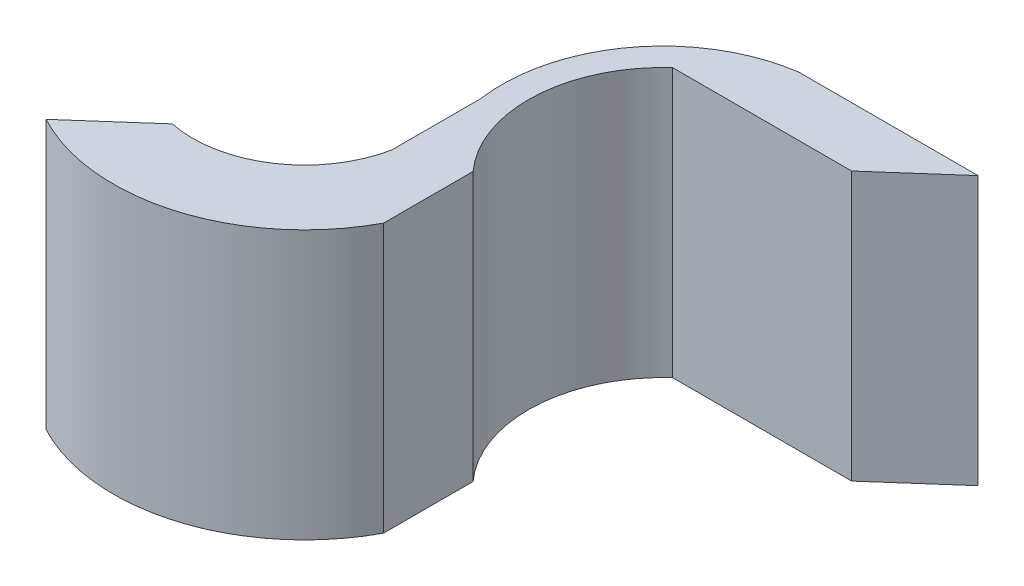
ISO-10303-21;
HEADER;
FILE_DESCRIPTION(('STEP AP214'),'2;1');
FILE_NAME('part.step','',(''),(''),'','','');
FILE_SCHEMA(('AUTOMOTIVE_DESIGN { 1 0 10303 214 1 1 1 1 }'));
ENDSEC;
DATA;
#1=APPLICATION_CONTEXT('core data for automotive mechanical design processes');
#2=APPLICATION_PROTOCOL_DEFINITION('international standard','automotive_design',2000,#1);
#3=PRODUCT_CONTEXT('',#1,'mechanical');
#4=PRODUCT('Part','Part','',(#3));
#5=PRODUCT_RELATED_PRODUCT_CATEGORY('part','',(#4));
#6=PRODUCT_DEFINITION_FORMATION('','',#4);
#7=PRODUCT_DEFINITION_CONTEXT('part definition',#1,'design');
#8=PRODUCT_DEFINITION('design','',#6,#7);
#9=PRODUCT_DEFINITION_SHAPE('','',#8);
#10=(LENGTH_UNIT() NAMED_UNIT(*) SI_UNIT(.MILLI.,.METRE.));
#11=(NAMED_UNIT(*) PLANE_ANGLE_UNIT() SI_UNIT($,.RADIAN.));
#12=(NAMED_UNIT(*) SI_UNIT($,.STERADIAN.) SOLID_ANGLE_UNIT());
#13=UNCERTAINTY_MEASURE_WITH_UNIT(LENGTH_MEASURE(1.E-05),#10,'distance_accuracy_value','');
#14=(GEOMETRIC_REPRESENTATION_CONTEXT(3) GLOBAL_UNCERTAINTY_ASSIGNED_CONTEXT((#13)) GLOBAL_UNIT_ASSIGNED_CONTEXT((#10,
#11,#12)) REPRESENTATION_CONTEXT('',''));
#15=CARTESIAN_POINT('',(0.,0.,0.));
#16=DIRECTION('',(0.,0.,1.));
#17=DIRECTION('',(1.,0.,0.));
#18=AXIS2_PLACEMENT_3D('',#15,#16,#17);
#19=CARTESIAN_POINT('',(0.199607837082,-0.15,0.02239378277661));
#20=DIRECTION('',(0.,0.,-1.));
#21=DIRECTION('',(-1.,0.,0.));
#22=AXIS2_PLACEMENT_3D('',#19,#20,#21);
#23=PLANE('',#22);
#24=DIRECTION('',(1.,0.,0.));
#25=VECTOR('',#24,1.);
#26=CARTESIAN_POINT('',(0.262107837082,-0.15,0.02239378277661));
#27=LINE('',#26,#25);
#28=CARTESIAN_POINT('',(0.199607837081283,-0.15,0.0223937827764583));
#29=VERTEX_POINT('',#28);
#30=CARTESIAN_POINT('',(0.399607837082,-0.15,0.02239378277661));
#31=VERTEX_POINT('',#30);
#32=EDGE_CURVE('E82',#29,#31,#27,.T.);
#33=ORIENTED_EDGE('',*,*,#32,.F.);
#34=DIRECTION('',(0.,1.,0.));
#35=VECTOR('',#34,1.);
#36=CARTESIAN_POINT('',(0.199607837081964,-0.15,0.0223937827763609));
#37=LINE('',#36,#35);
#38=CARTESIAN_POINT('',(0.199607837081283,0.15,0.0223937827764583));
#39=VERTEX_POINT('',#38);
#40=EDGE_CURVE('E174',#39,#29,#37,.F.);
#41=ORIENTED_EDGE('',*,*,#40,.F.);
#42=DIRECTION('',(1.,0.,0.));
#43=VECTOR('',#42,1.);
#44=CARTESIAN_POINT('',(0.262107837082,0.15,0.02239378277661));
#45=LINE('',#44,#43);
#46=CARTESIAN_POINT('',(0.399607837082,0.15,0.02239378277661));
#47=VERTEX_POINT('',#46);
#48=EDGE_CURVE('E104',#47,#39,#45,.F.);
#49=ORIENTED_EDGE('',*,*,#48,.F.);
#50=DIRECTION('',(0.,1.,0.));
#51=VECTOR('',#50,1.);
#52=CARTESIAN_POINT('',(0.399607837082,-0.15,0.02239378277661));
#53=LINE('',#52,#51);
#54=EDGE_CURVE('E92',#47,#31,#53,.F.);
#55=ORIENTED_EDGE('',*,*,#54,.T.);
#56=EDGE_LOOP('',(#33,#41,#49,#55));
#57=FACE_BOUND('',#56,.T.);
#58=ADVANCED_FACE('F16',(#57),#23,.T.);
#59=CARTESIAN_POINT('',(0.399607837082,-0.15,0.02239378277661));
#60=DIRECTION('',(-0.661437827766065,0.,-0.750000000000073));
#61=DIRECTION('',(-0.750000000000073,0.,0.661437827766065));
#62=AXIS2_PLACEMENT_3D('',#59,#60,#61);
#63=PLANE('',#62);
#64=DIRECTION('',(0.749999999999974,0.,-0.661437827766177));
#65=VECTOR('',#64,1.);
#66=CARTESIAN_POINT('',(0.324607837082,0.15,0.08853756555323));
#67=LINE('',#66,#65);
#68=CARTESIAN_POINT('',(0.324607837082,0.15,0.08853756555323));
#69=VERTEX_POINT('',#68);
#70=EDGE_CURVE('E97',#69,#47,#67,.T.);
#71=ORIENTED_EDGE('',*,*,#70,.F.);
#72=DIRECTION('',(0.,1.,0.));
#73=VECTOR('',#72,1.);
#74=CARTESIAN_POINT('',(0.324607837082,0.15,0.08853756555323));
#75=LINE('',#74,#73);
#76=CARTESIAN_POINT('',(0.324607837081997,-0.15,0.0885375655532263));
#77=VERTEX_POINT('',#76);
#78=EDGE_CURVE('E101',#77,#69,#75,.T.);
#79=ORIENTED_EDGE('',*,*,#78,.F.);
#80=DIRECTION('',(-0.750000000000073,0.,0.661437827766065));
#81=VECTOR('',#80,1.);
#82=CARTESIAN_POINT('',(0.399607837082,-0.15,0.02239378277661));
#83=LINE('',#82,#81);
#84=EDGE_CURVE('E125',#31,#77,#83,.T.);
#85=ORIENTED_EDGE('',*,*,#84,.F.);
#86=ORIENTED_EDGE('',*,*,#54,.F.);
#87=EDGE_LOOP('',(#71,#79,#85,#86));
#88=FACE_BOUND('',#87,.T.);
#89=ADVANCED_FACE('F99',(#88),#63,.F.);
#90=CARTESIAN_POINT('',(0.225,-0.15,0.2));
#91=DIRECTION('',(0.,1.,0.));
#92=DIRECTION('',(0.,0.,1.));
#93=AXIS2_PLACEMENT_3D('',#90,#91,#92);
#94=CYLINDRICAL_SURFACE('',#93,0.179412180005);
#95=CARTESIAN_POINT('',(0.225,-0.15,0.2));
#96=DIRECTION('',(0.,1.,0.));
#97=DIRECTION('',(0.,0.,1.));
#98=AXIS2_PLACEMENT_3D('',#95,#96,#97);
#99=CIRCLE('',#98,0.179412180005);
#100=CARTESIAN_POINT('',(0.0473937827764584,-0.15,0.225392162918717));
#101=VERTEX_POINT('',#100);
#102=EDGE_CURVE('E19',#29,#101,#99,.T.);
#103=ORIENTED_EDGE('',*,*,#102,.T.);
#104=DIRECTION('',(0.,1.,0.));
#105=VECTOR('',#104,1.);
#106=CARTESIAN_POINT('',(0.04739378277661,-0.15,0.225392162918));
#107=LINE('',#106,#105);
#108=CARTESIAN_POINT('',(0.0473937827764584,0.15,0.225392162918717));
#109=VERTEX_POINT('',#108);
#110=EDGE_CURVE('E156',#109,#101,#107,.F.);
#111=ORIENTED_EDGE('',*,*,#110,.F.);
#112=CARTESIAN_POINT('',(0.225,0.15,0.2));
#113=DIRECTION('',(0.,1.,0.));
#114=DIRECTION('',(0.,0.,1.));
#115=AXIS2_PLACEMENT_3D('',#112,#113,#114);
#116=CIRCLE('',#115,0.179412180005);
#117=EDGE_CURVE('E114',#109,#39,#116,.F.);
#118=ORIENTED_EDGE('',*,*,#117,.T.);
#119=ORIENTED_EDGE('',*,*,#40,.T.);
#120=EDGE_LOOP('',(#103,#111,#118,#119));
#121=FACE_BOUND('',#120,.T.);
#122=ADVANCED_FACE('F179',(#121),#94,.T.);
#123=CARTESIAN_POINT('',(0.124607837082,0.15,0.08853756555323));
#124=DIRECTION('',(0.,0.,1.));
#125=DIRECTION('',(1.,0.,0.));
#126=AXIS2_PLACEMENT_3D('',#123,#124,#125);
#127=PLANE('',#126);
#128=DIRECTION('',(1.,0.,0.));
#129=VECTOR('',#128,1.);
#130=CARTESIAN_POINT('',(0.124607837082,0.15,0.08853756555323));
#131=LINE('',#130,#129);
#132=CARTESIAN_POINT('',(0.124607837081955,0.15,0.08853756555323));
#133=VERTEX_POINT('',#132);
#134=EDGE_CURVE('E107',#69,#133,#131,.F.);
#135=ORIENTED_EDGE('',*,*,#134,.T.);
#136=DIRECTION('',(0.,1.,0.));
#137=VECTOR('',#136,1.);
#138=CARTESIAN_POINT('',(0.12460783708196,0.15,0.0885375655531852));
#139=LINE('',#138,#137);
#140=CARTESIAN_POINT('',(0.124607837081955,-0.15,0.08853756555323));
#141=VERTEX_POINT('',#140);
#142=EDGE_CURVE('E152',#133,#141,#139,.F.);
#143=ORIENTED_EDGE('',*,*,#142,.T.);
#144=DIRECTION('',(1.,0.,0.));
#145=VECTOR('',#144,1.);
#146=CARTESIAN_POINT('',(0.124607837082,-0.15,0.08853756555323));
#147=LINE('',#146,#145);
#148=EDGE_CURVE('E117',#141,#77,#147,.T.);
#149=ORIENTED_EDGE('',*,*,#148,.T.);
#150=ORIENTED_EDGE('',*,*,#78,.T.);
#151=EDGE_LOOP('',(#135,#143,#149,#150));
#152=FACE_BOUND('',#151,.T.);
#153=ADVANCED_FACE('F116',(#152),#127,.T.);
#154=CARTESIAN_POINT('',(0.04739378277661,-0.15,0.325392162918));
#155=DIRECTION('',(-1.,0.,0.));
#156=DIRECTION('',(0.,0.,1.));
#157=AXIS2_PLACEMENT_3D('',#154,#155,#156);
#158=PLANE('',#157);
#159=DIRECTION('',(0.,0.,-1.));
#160=VECTOR('',#159,1.);
#161=CARTESIAN_POINT('',(0.04739378277661,-0.15,0.312892162918));
#162=LINE('',#161,#160);
#163=CARTESIAN_POINT('',(0.04739378277661,-0.15,0.325392162917781));
#164=VERTEX_POINT('',#163);
#165=EDGE_CURVE('E154',#164,#101,#162,.T.);
#166=ORIENTED_EDGE('',*,*,#165,.F.);
#167=DIRECTION('',(0.,-1.,0.));
#168=VECTOR('',#167,1.);
#169=CARTESIAN_POINT('',(0.0473937827765229,-0.15,0.325392162917982));
#170=LINE('',#169,#168);
#171=CARTESIAN_POINT('',(0.04739378277661,0.15,0.325392162917781));
#172=VERTEX_POINT('',#171);
#173=EDGE_CURVE('E150',#164,#172,#170,.F.);
#174=ORIENTED_EDGE('',*,*,#173,.T.);
#175=DIRECTION('',(0.,0.,1.));
#176=VECTOR('',#175,1.);
#177=CARTESIAN_POINT('',(0.04739378277661,0.15,0.312892162918));
#178=LINE('',#177,#176);
#179=EDGE_CURVE('E169',#109,#172,#178,.T.);
#180=ORIENTED_EDGE('',*,*,#179,.F.);
#181=ORIENTED_EDGE('',*,*,#110,.T.);
#182=EDGE_LOOP('',(#166,#174,#180,#181));
#183=FACE_BOUND('',#182,.T.);
#184=ADVANCED_FACE('F185',(#183),#158,.T.);
#185=CARTESIAN_POINT('',(0.225,0.15,0.2));
#186=DIRECTION('',(0.,1.,0.));
#187=DIRECTION('',(0.,0.,1.));
#188=AXIS2_PLACEMENT_3D('',#185,#186,#187);
#189=CYLINDRICAL_SURFACE('',#188,0.150008202003);
#190=CARTESIAN_POINT('',(0.225,0.15,0.2));
#191=DIRECTION('',(0.,1.,0.));
#192=DIRECTION('',(0.,0.,1.));
#193=AXIS2_PLACEMENT_3D('',#190,#191,#192);
#194=CIRCLE('',#193,0.150008202003);
#195=CARTESIAN_POINT('',(0.113537565553,0.15,0.300392162918));
#196=VERTEX_POINT('',#195);
#197=EDGE_CURVE('E110',#196,#133,#194,.F.);
#198=ORIENTED_EDGE('',*,*,#197,.F.);
#199=DIRECTION('',(0.,1.,0.));
#200=VECTOR('',#199,1.);
#201=CARTESIAN_POINT('',(0.113537565553,0.15,0.300392162918));
#202=LINE('',#201,#200);
#203=CARTESIAN_POINT('',(0.113537565553,-0.15,0.300392162918));
#204=VERTEX_POINT('',#203);
#205=EDGE_CURVE('E193',#204,#196,#202,.T.);
#206=ORIENTED_EDGE('',*,*,#205,.F.);
#207=CARTESIAN_POINT('',(0.225,-0.15,0.2));
#208=DIRECTION('',(0.,1.,0.));
#209=DIRECTION('',(0.,0.,1.));
#210=AXIS2_PLACEMENT_3D('',#207,#208,#209);
#211=CIRCLE('',#210,0.150008202003);
#212=EDGE_CURVE('E153',#141,#204,#211,.T.);
#213=ORIENTED_EDGE('',*,*,#212,.F.);
#214=ORIENTED_EDGE('',*,*,#142,.F.);
#215=EDGE_LOOP('',(#198,#206,#213,#214));
#216=FACE_BOUND('',#215,.T.);
#217=ADVANCED_FACE('F257',(#216),#189,.F.);
#218=CARTESIAN_POINT('',(-0.075,-0.15,0.3));
#219=DIRECTION('',(0.,-1.,0.));
#220=DIRECTION('',(0.,0.,-1.));
#221=AXIS2_PLACEMENT_3D('',#218,#219,#220);
#222=CYLINDRICAL_SURFACE('',#221,0.125);
#223=CARTESIAN_POINT('',(-0.075,-0.15,0.3));
#224=DIRECTION('',(0.,-1.,0.));
#225=DIRECTION('',(0.,0.,-1.));
#226=AXIS2_PLACEMENT_3D('',#223,#224,#225);
#227=CIRCLE('',#226,0.125);
#228=CARTESIAN_POINT('',(-0.100392162917779,-0.15,0.422393782776805));
#229=VERTEX_POINT('',#228);
#230=EDGE_CURVE('E147',#164,#229,#227,.T.);
#231=ORIENTED_EDGE('',*,*,#230,.T.);
#232=DIRECTION('',(0.,1.,0.));
#233=VECTOR('',#232,1.);
#234=CARTESIAN_POINT('',(-0.100392162918,-0.15,0.422393782777));
#235=LINE('',#234,#233);
#236=CARTESIAN_POINT('',(-0.100392162917779,0.15,0.422393782776805));
#237=VERTEX_POINT('',#236);
#238=EDGE_CURVE('E141',#237,#229,#235,.F.);
#239=ORIENTED_EDGE('',*,*,#238,.F.);
#240=CARTESIAN_POINT('',(-0.075,0.15,0.3));
#241=DIRECTION('',(0.,-1.,0.));
#242=DIRECTION('',(0.,0.,-1.));
#243=AXIS2_PLACEMENT_3D('',#240,#241,#242);
#244=CIRCLE('',#243,0.125);
#245=EDGE_CURVE('E142',#237,#172,#244,.F.);
#246=ORIENTED_EDGE('',*,*,#245,.T.);
#247=ORIENTED_EDGE('',*,*,#173,.F.);
#248=EDGE_LOOP('',(#231,#239,#246,#247));
#249=FACE_BOUND('',#248,.T.);
#250=ADVANCED_FACE('F187',(#249),#222,.F.);
#251=CARTESIAN_POINT('',(-0.009540642438726,-0.15,0.454402307326));
#252=DIRECTION('',(0.,1.,0.));
#253=DIRECTION('',(0.,0.,1.));
#254=AXIS2_PLACEMENT_3D('',#251,#252,#253);
#255=PLANE('',#254);
#256=CARTESIAN_POINT('',(-0.075,-0.15,0.3));
#257=DIRECTION('',(0.,-1.,0.));
#258=DIRECTION('',(0.,0.,-1.));
#259=AXIS2_PLACEMENT_3D('',#256,#257,#258);
#260=CIRCLE('',#259,0.213600093633);
#261=CARTESIAN_POINT('',(-0.175392162917818,-0.15,0.488537565553151));
#262=VERTEX_POINT('',#261);
#263=CARTESIAN_POINT('',(0.113537565553,-0.15,0.400392162918051));
#264=VERTEX_POINT('',#263);
#265=EDGE_CURVE('E138',#262,#264,#260,.F.);
#266=ORIENTED_EDGE('',*,*,#265,.F.);
#267=DIRECTION('',(-0.750000000000073,0.,0.661437827766065));
#268=VECTOR('',#267,1.);
#269=CARTESIAN_POINT('',(-0.100392162918,-0.15,0.422393782777));
#270=LINE('',#269,#268);
#271=EDGE_CURVE('E145',#229,#262,#270,.T.);
#272=ORIENTED_EDGE('',*,*,#271,.F.);
#273=ORIENTED_EDGE('',*,*,#230,.F.);
#274=ORIENTED_EDGE('',*,*,#165,.T.);
#275=ORIENTED_EDGE('',*,*,#102,.F.);
#276=ORIENTED_EDGE('',*,*,#32,.T.);
#277=ORIENTED_EDGE('',*,*,#84,.T.);
#278=ORIENTED_EDGE('',*,*,#148,.F.);
#279=ORIENTED_EDGE('',*,*,#212,.T.);
#280=DIRECTION('',(0.,0.,-1.));
#281=VECTOR('',#280,1.);
#282=CARTESIAN_POINT('',(0.113537565553,-0.15,0.400392162918));
#283=LINE('',#282,#281);
#284=EDGE_CURVE('E149',#264,#204,#283,.T.);
#285=ORIENTED_EDGE('',*,*,#284,.F.);
#286=EDGE_LOOP('',(#266,#272,#273,#274,#275,#276,#277,#278,#279,#285));
#287=FACE_BOUND('',#286,.T.);
#288=ADVANCED_FACE('F181',(#287),#255,.F.);
#289=CARTESIAN_POINT('',(0.113537565553,0.15,0.400392162918));
#290=DIRECTION('',(1.,0.,0.));
#291=DIRECTION('',(0.,0.,-1.));
#292=AXIS2_PLACEMENT_3D('',#289,#290,#291);
#293=PLANE('',#292);
#294=DIRECTION('',(0.,0.,-1.));
#295=VECTOR('',#294,1.);
#296=CARTESIAN_POINT('',(0.113537565553,0.15,0.400392162918));
#297=LINE('',#296,#295);
#298=CARTESIAN_POINT('',(0.113537565553,0.15,0.400392162918051));
#299=VERTEX_POINT('',#298);
#300=EDGE_CURVE('E146',#196,#299,#297,.F.);
#301=ORIENTED_EDGE('',*,*,#300,.T.);
#302=DIRECTION('',(0.,-1.,0.));
#303=VECTOR('',#302,1.);
#304=CARTESIAN_POINT('',(0.113537565553042,0.15,0.400392162918022));
#305=LINE('',#304,#303);
#306=EDGE_CURVE('E137',#264,#299,#305,.F.);
#307=ORIENTED_EDGE('',*,*,#306,.F.);
#308=ORIENTED_EDGE('',*,*,#284,.T.);
#309=ORIENTED_EDGE('',*,*,#205,.T.);
#310=EDGE_LOOP('',(#301,#307,#308,#309));
#311=FACE_BOUND('',#310,.T.);
#312=ADVANCED_FACE('F210',(#311),#293,.T.);
#313=CARTESIAN_POINT('',(-0.009540642438726,0.15,0.454402307326));
#314=DIRECTION('',(0.,-1.,0.));
#315=DIRECTION('',(0.,0.,-1.));
#316=AXIS2_PLACEMENT_3D('',#313,#314,#315);
#317=PLANE('',#316);
#318=ORIENTED_EDGE('',*,*,#245,.F.);
#319=DIRECTION('',(-0.750000000000073,0.,0.661437827766065));
#320=VECTOR('',#319,1.);
#321=CARTESIAN_POINT('',(-0.100392162918,0.15,0.422393782777));
#322=LINE('',#321,#320);
#323=CARTESIAN_POINT('',(-0.175392162917818,0.15,0.488537565553151));
#324=VERTEX_POINT('',#323);
#325=EDGE_CURVE('E34',#324,#237,#322,.F.);
#326=ORIENTED_EDGE('',*,*,#325,.F.);
#327=CARTESIAN_POINT('',(-0.075,0.15,0.3));
#328=DIRECTION('',(0.,-1.,0.));
#329=DIRECTION('',(0.,0.,-1.));
#330=AXIS2_PLACEMENT_3D('',#327,#328,#329);
#331=CIRCLE('',#330,0.213600093633);
#332=EDGE_CURVE('E25',#299,#324,#331,.T.);
#333=ORIENTED_EDGE('',*,*,#332,.F.);
#334=ORIENTED_EDGE('',*,*,#300,.F.);
#335=ORIENTED_EDGE('',*,*,#197,.T.);
#336=ORIENTED_EDGE('',*,*,#134,.F.);
#337=ORIENTED_EDGE('',*,*,#70,.T.);
#338=ORIENTED_EDGE('',*,*,#48,.T.);
#339=ORIENTED_EDGE('',*,*,#117,.F.);
#340=ORIENTED_EDGE('',*,*,#179,.T.);
#341=EDGE_LOOP('',(#318,#326,#333,#334,#335,#336,#337,#338,#339,#340));
#342=FACE_BOUND('',#341,.T.);
#343=ADVANCED_FACE('F108',(#342),#317,.F.);
#344=CARTESIAN_POINT('',(-0.100392162918,-0.15,0.422393782777));
#345=DIRECTION('',(-0.661437827766065,0.,-0.750000000000073));
#346=DIRECTION('',(-0.750000000000073,0.,0.661437827766065));
#347=AXIS2_PLACEMENT_3D('',#344,#345,#346);
#348=PLANE('',#347);
#349=ORIENTED_EDGE('',*,*,#325,.T.);
#350=ORIENTED_EDGE('',*,*,#238,.T.);
#351=ORIENTED_EDGE('',*,*,#271,.T.);
#352=DIRECTION('',(0.,-1.,0.));
#353=VECTOR('',#352,1.);
#354=CARTESIAN_POINT('',(-0.175392162918022,0.15,0.488537565553042));
#355=LINE('',#354,#353);
#356=EDGE_CURVE('E11',#324,#262,#355,.T.);
#357=ORIENTED_EDGE('',*,*,#356,.F.);
#358=EDGE_LOOP('',(#349,#350,#351,#357));
#359=FACE_BOUND('',#358,.T.);
#360=ADVANCED_FACE('F218',(#359),#348,.T.);
#361=CARTESIAN_POINT('',(-0.075,0.15,0.3));
#362=DIRECTION('',(0.,-1.,0.));
#363=DIRECTION('',(0.,0.,-1.));
#364=AXIS2_PLACEMENT_3D('',#361,#362,#363);
#365=CYLINDRICAL_SURFACE('',#364,0.213600093633);
#366=ORIENTED_EDGE('',*,*,#332,.T.);
#367=ORIENTED_EDGE('',*,*,#356,.T.);
#368=ORIENTED_EDGE('',*,*,#265,.T.);
#369=ORIENTED_EDGE('',*,*,#306,.T.);
#370=EDGE_LOOP('',(#366,#367,#368,#369));
#371=FACE_BOUND('',#370,.T.);
#372=ADVANCED_FACE('F209',(#371),#365,.T.);
#373=CLOSED_SHELL('',(#58,#89,#122,#153,#184,#217,#250,#288,#312,#343,#360,#372));
#374=MANIFOLD_SOLID_BREP('B1',#373);
#375=ADVANCED_BREP_SHAPE_REPRESENTATION('',(#18,#374),#14);
#376=SHAPE_DEFINITION_REPRESENTATION(#9,#375);
ENDSEC;
END-ISO-10303-21;
